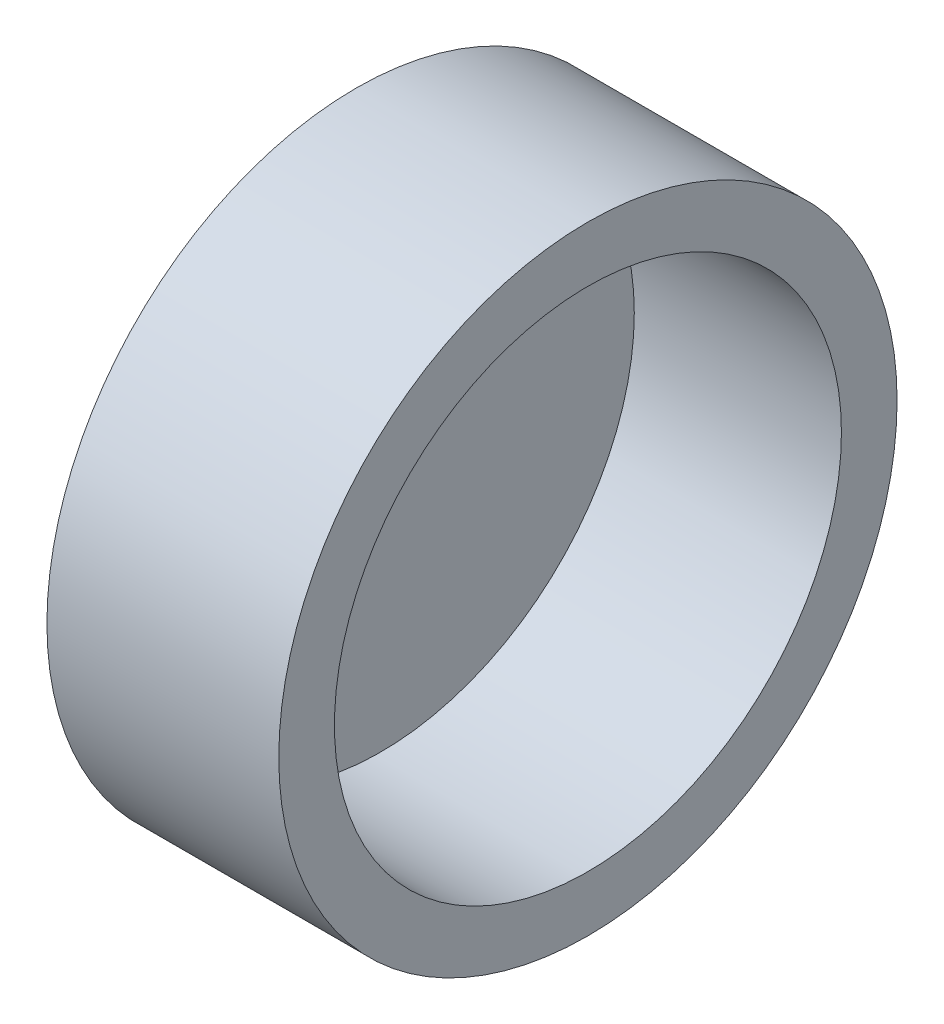
ISO-10303-21;
HEADER;
FILE_DESCRIPTION(('STEP AP214'),'2;1');
FILE_NAME('part.step','',(''),(''),'','','');
FILE_SCHEMA(('AUTOMOTIVE_DESIGN { 1 0 10303 214 1 1 1 1 }'));
ENDSEC;
DATA;
#1=APPLICATION_CONTEXT('core data for automotive mechanical design processes');
#2=APPLICATION_PROTOCOL_DEFINITION('international standard','automotive_design',2000,#1);
#3=PRODUCT_CONTEXT('',#1,'mechanical');
#4=PRODUCT('Part','Part','',(#3));
#5=PRODUCT_RELATED_PRODUCT_CATEGORY('part','',(#4));
#6=PRODUCT_DEFINITION_FORMATION('','',#4);
#7=PRODUCT_DEFINITION_CONTEXT('part definition',#1,'design');
#8=PRODUCT_DEFINITION('design','',#6,#7);
#9=PRODUCT_DEFINITION_SHAPE('','',#8);
#10=(LENGTH_UNIT() NAMED_UNIT(*) SI_UNIT(.MILLI.,.METRE.));
#11=(NAMED_UNIT(*) PLANE_ANGLE_UNIT() SI_UNIT($,.RADIAN.));
#12=(NAMED_UNIT(*) SI_UNIT($,.STERADIAN.) SOLID_ANGLE_UNIT());
#13=UNCERTAINTY_MEASURE_WITH_UNIT(LENGTH_MEASURE(1.E-05),#10,'distance_accuracy_value','');
#14=(GEOMETRIC_REPRESENTATION_CONTEXT(3) GLOBAL_UNCERTAINTY_ASSIGNED_CONTEXT((#13)) GLOBAL_UNIT_ASSIGNED_CONTEXT((#10,
#11,#12)) REPRESENTATION_CONTEXT('',''));
#15=CARTESIAN_POINT('',(0.,0.,0.));
#16=DIRECTION('',(0.,0.,1.));
#17=DIRECTION('',(1.,0.,0.));
#18=AXIS2_PLACEMENT_3D('',#15,#16,#17);
#19=CARTESIAN_POINT('',(150.,0.,0.));
#20=DIRECTION('',(1.,0.,0.));
#21=DIRECTION('',(0.,0.,-1.));
#22=AXIS2_PLACEMENT_3D('',#19,#20,#21);
#23=PLANE('',#22);
#24=CARTESIAN_POINT('',(150.,0.,0.));
#25=DIRECTION('',(1.,0.,0.));
#26=DIRECTION('',(0.,0.,-1.));
#27=AXIS2_PLACEMENT_3D('',#24,#25,#26);
#28=CIRCLE('',#27,200.);
#29=CARTESIAN_POINT('',(150.,0.,-200.));
#30=VERTEX_POINT('',#29);
#31=EDGE_CURVE('E11',#30,#30,#28,.T.);
#32=ORIENTED_EDGE('',*,*,#31,.T.);
#33=EDGE_LOOP('',(#32));
#34=FACE_BOUND('',#33,.T.);
#35=CARTESIAN_POINT('',(150.,0.,0.));
#36=DIRECTION('',(1.,0.,0.));
#37=DIRECTION('',(0.,0.,-1.));
#38=AXIS2_PLACEMENT_3D('',#35,#36,#37);
#39=CIRCLE('',#38,164.);
#40=CARTESIAN_POINT('',(150.,0.,-164.));
#41=VERTEX_POINT('',#40);
#42=EDGE_CURVE('E58',#41,#41,#39,.T.);
#43=ORIENTED_EDGE('',*,*,#42,.F.);
#44=EDGE_LOOP('',(#43));
#45=FACE_BOUND('',#44,.T.);
#46=ADVANCED_FACE('F47',(#34,#45),#23,.T.);
#47=CARTESIAN_POINT('',(0.,0.,0.));
#48=DIRECTION('',(1.,0.,0.));
#49=DIRECTION('',(0.,0.,-1.));
#50=AXIS2_PLACEMENT_3D('',#47,#48,#49);
#51=PLANE('',#50);
#52=CARTESIAN_POINT('',(0.,0.,0.));
#53=DIRECTION('',(1.,0.,0.));
#54=DIRECTION('',(0.,0.,-1.));
#55=AXIS2_PLACEMENT_3D('',#52,#53,#54);
#56=CIRCLE('',#55,200.);
#57=CARTESIAN_POINT('',(0.,0.,-200.));
#58=VERTEX_POINT('',#57);
#59=EDGE_CURVE('E51',#58,#58,#56,.T.);
#60=ORIENTED_EDGE('',*,*,#59,.F.);
#61=EDGE_LOOP('',(#60));
#62=FACE_BOUND('',#61,.T.);
#63=CARTESIAN_POINT('',(0.,0.,0.));
#64=DIRECTION('',(1.,0.,0.));
#65=DIRECTION('',(0.,0.,-1.));
#66=AXIS2_PLACEMENT_3D('',#63,#64,#65);
#67=CIRCLE('',#66,164.);
#68=CARTESIAN_POINT('',(0.,0.,-164.));
#69=VERTEX_POINT('',#68);
#70=EDGE_CURVE('E60',#69,#69,#67,.T.);
#71=ORIENTED_EDGE('',*,*,#70,.T.);
#72=EDGE_LOOP('',(#71));
#73=FACE_BOUND('',#72,.T.);
#74=ADVANCED_FACE('F70',(#62,#73),#51,.F.);
#75=CARTESIAN_POINT('',(150.,0.,0.));
#76=DIRECTION('',(-1.,0.,0.));
#77=DIRECTION('',(0.,0.,1.));
#78=AXIS2_PLACEMENT_3D('',#75,#76,#77);
#79=CYLINDRICAL_SURFACE('',#78,200.);
#80=ORIENTED_EDGE('',*,*,#31,.F.);
#81=EDGE_LOOP('',(#80));
#82=FACE_BOUND('',#81,.T.);
#83=ORIENTED_EDGE('',*,*,#59,.T.);
#84=EDGE_LOOP('',(#83));
#85=FACE_BOUND('',#84,.T.);
#86=ADVANCED_FACE('F49',(#82,#85),#79,.T.);
#87=CARTESIAN_POINT('',(150.,0.,0.));
#88=DIRECTION('',(-1.,0.,0.));
#89=DIRECTION('',(0.,0.,1.));
#90=AXIS2_PLACEMENT_3D('',#87,#88,#89);
#91=CYLINDRICAL_SURFACE('',#90,164.);
#92=ORIENTED_EDGE('',*,*,#42,.T.);
#93=EDGE_LOOP('',(#92));
#94=FACE_BOUND('',#93,.T.);
#95=ORIENTED_EDGE('',*,*,#70,.F.);
#96=EDGE_LOOP('',(#95));
#97=FACE_BOUND('',#96,.T.);
#98=ADVANCED_FACE('F66',(#94,#97),#91,.F.);
#99=CLOSED_SHELL('',(#46,#74,#86,#98));
#100=MANIFOLD_SOLID_BREP('B2',#99);
#101=CARTESIAN_POINT('',(16.,0.,0.));
#102=DIRECTION('',(-1.,0.,0.));
#103=DIRECTION('',(0.,0.,1.));
#104=AXIS2_PLACEMENT_3D('',#101,#102,#103);
#105=CYLINDRICAL_SURFACE('',#104,164.);
#106=CARTESIAN_POINT('',(16.,0.,0.));
#107=DIRECTION('',(1.,0.,0.));
#108=DIRECTION('',(0.,0.,-1.));
#109=AXIS2_PLACEMENT_3D('',#106,#107,#108);
#110=CIRCLE('',#109,164.);
#111=CARTESIAN_POINT('',(16.,0.,-164.));
#112=VERTEX_POINT('',#111);
#113=EDGE_CURVE('E46',#112,#112,#110,.T.);
#114=ORIENTED_EDGE('',*,*,#113,.F.);
#115=EDGE_LOOP('',(#114));
#116=FACE_BOUND('',#115,.T.);
#117=CARTESIAN_POINT('',(-16.,0.,0.));
#118=DIRECTION('',(1.,0.,0.));
#119=DIRECTION('',(0.,0.,-1.));
#120=AXIS2_PLACEMENT_3D('',#117,#118,#119);
#121=CIRCLE('',#120,164.);
#122=CARTESIAN_POINT('',(-16.,0.,-164.));
#123=VERTEX_POINT('',#122);
#124=EDGE_CURVE('E112',#123,#123,#121,.T.);
#125=ORIENTED_EDGE('',*,*,#124,.T.);
#126=EDGE_LOOP('',(#125));
#127=FACE_BOUND('',#126,.T.);
#128=ADVANCED_FACE('F109',(#116,#127),#105,.T.);
#129=CARTESIAN_POINT('',(16.,0.,0.));
#130=DIRECTION('',(1.,0.,0.));
#131=DIRECTION('',(0.,0.,-1.));
#132=AXIS2_PLACEMENT_3D('',#129,#130,#131);
#133=PLANE('',#132);
#134=ORIENTED_EDGE('',*,*,#113,.T.);
#135=EDGE_LOOP('',(#134));
#136=FACE_BOUND('',#135,.T.);
#137=ADVANCED_FACE('F124',(#136),#133,.T.);
#138=CARTESIAN_POINT('',(-16.,0.,0.));
#139=DIRECTION('',(1.,0.,0.));
#140=DIRECTION('',(0.,0.,-1.));
#141=AXIS2_PLACEMENT_3D('',#138,#139,#140);
#142=PLANE('',#141);
#143=ORIENTED_EDGE('',*,*,#124,.F.);
#144=EDGE_LOOP('',(#143));
#145=FACE_BOUND('',#144,.T.);
#146=ADVANCED_FACE('F122',(#145),#142,.F.);
#147=CLOSED_SHELL('',(#128,#137,#146));
#148=MANIFOLD_SOLID_BREP('B6',#147);
#149=ADVANCED_BREP_SHAPE_REPRESENTATION('',(#18,#100,#148),#14);
#150=SHAPE_DEFINITION_REPRESENTATION(#9,#149);
ENDSEC;
END-ISO-10303-21;
